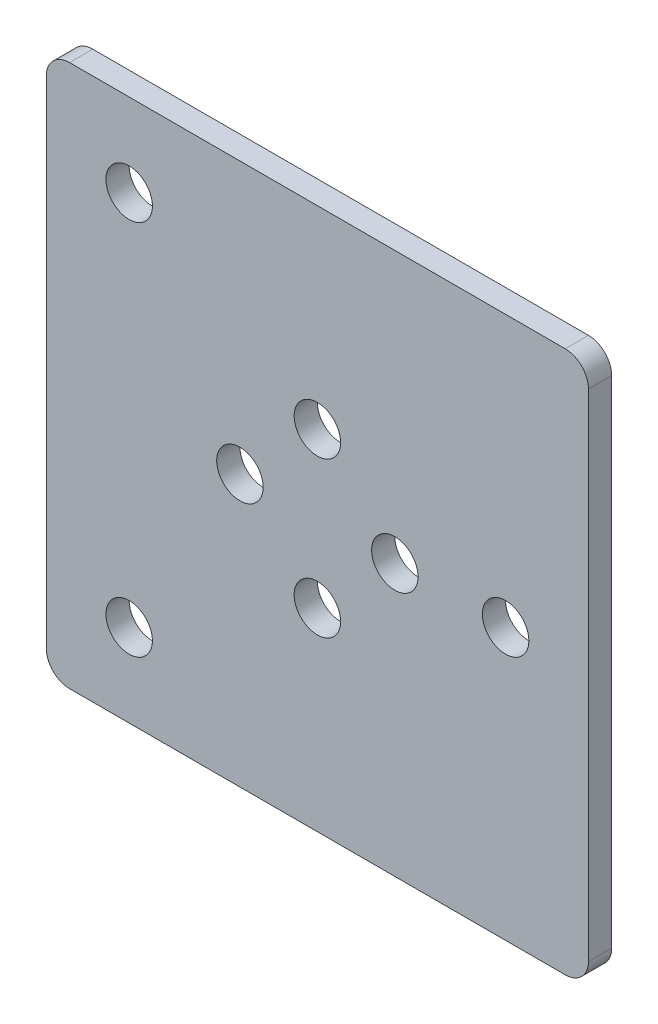
ISO-10303-21;
HEADER;
FILE_DESCRIPTION(('STEP AP214'),'2;1');
FILE_NAME('part.step','',(''),(''),'','','');
FILE_SCHEMA(('AUTOMOTIVE_DESIGN { 1 0 10303 214 1 1 1 1 }'));
ENDSEC;
DATA;
#1=APPLICATION_CONTEXT('core data for automotive mechanical design processes');
#2=APPLICATION_PROTOCOL_DEFINITION('international standard','automotive_design',2000,#1);
#3=PRODUCT_CONTEXT('',#1,'mechanical');
#4=PRODUCT('Part','Part','',(#3));
#5=PRODUCT_RELATED_PRODUCT_CATEGORY('part','',(#4));
#6=PRODUCT_DEFINITION_FORMATION('','',#4);
#7=PRODUCT_DEFINITION_CONTEXT('part definition',#1,'design');
#8=PRODUCT_DEFINITION('design','',#6,#7);
#9=PRODUCT_DEFINITION_SHAPE('','',#8);
#10=(LENGTH_UNIT() NAMED_UNIT(*) SI_UNIT(.MILLI.,.METRE.));
#11=(NAMED_UNIT(*) PLANE_ANGLE_UNIT() SI_UNIT($,.RADIAN.));
#12=(NAMED_UNIT(*) SI_UNIT($,.STERADIAN.) SOLID_ANGLE_UNIT());
#13=UNCERTAINTY_MEASURE_WITH_UNIT(LENGTH_MEASURE(1.E-05),#10,'distance_accuracy_value','');
#14=(GEOMETRIC_REPRESENTATION_CONTEXT(3) GLOBAL_UNCERTAINTY_ASSIGNED_CONTEXT((#13)) GLOBAL_UNIT_ASSIGNED_CONTEXT((#10,
#11,#12)) REPRESENTATION_CONTEXT('',''));
#15=CARTESIAN_POINT('',(0.,0.,0.));
#16=DIRECTION('',(0.,0.,1.));
#17=DIRECTION('',(1.,0.,0.));
#18=AXIS2_PLACEMENT_3D('',#15,#16,#17);
#19=CARTESIAN_POINT('',(35.,0.,3.));
#20=DIRECTION('',(1.,0.,0.));
#21=DIRECTION('',(0.,1.,0.));
#22=AXIS2_PLACEMENT_3D('',#19,#20,#21);
#23=PLANE('',#22);
#24=DIRECTION('',(0.,-1.,0.));
#25=VECTOR('',#24,1.);
#26=CARTESIAN_POINT('',(35.,0.,3.));
#27=LINE('',#26,#25);
#28=CARTESIAN_POINT('',(35.,32.,3.));
#29=VERTEX_POINT('',#28);
#30=CARTESIAN_POINT('',(35.,-32.,3.));
#31=VERTEX_POINT('',#30);
#32=EDGE_CURVE('E165',#29,#31,#27,.T.);
#33=ORIENTED_EDGE('',*,*,#32,.T.);
#34=DIRECTION('',(0.,0.,-1.));
#35=VECTOR('',#34,1.);
#36=CARTESIAN_POINT('',(35.,-32.,0.));
#37=LINE('',#36,#35);
#38=CARTESIAN_POINT('',(35.,-32.,0.));
#39=VERTEX_POINT('',#38);
#40=EDGE_CURVE('E157',#31,#39,#37,.T.);
#41=ORIENTED_EDGE('',*,*,#40,.T.);
#42=DIRECTION('',(0.,-1.,0.));
#43=VECTOR('',#42,1.);
#44=CARTESIAN_POINT('',(35.,0.,0.));
#45=LINE('',#44,#43);
#46=CARTESIAN_POINT('',(35.,32.,0.));
#47=VERTEX_POINT('',#46);
#48=EDGE_CURVE('E163',#47,#39,#45,.T.);
#49=ORIENTED_EDGE('',*,*,#48,.F.);
#50=DIRECTION('',(0.,0.,-1.));
#51=VECTOR('',#50,1.);
#52=CARTESIAN_POINT('',(35.,32.,3.));
#53=LINE('',#52,#51);
#54=EDGE_CURVE('E155',#47,#29,#53,.F.);
#55=ORIENTED_EDGE('',*,*,#54,.T.);
#56=EDGE_LOOP('',(#33,#41,#49,#55));
#57=FACE_BOUND('',#56,.T.);
#58=ADVANCED_FACE('F38',(#57),#23,.T.);
#59=CARTESIAN_POINT('',(0.,35.,3.));
#60=DIRECTION('',(0.,1.,0.));
#61=DIRECTION('',(0.,0.,1.));
#62=AXIS2_PLACEMENT_3D('',#59,#60,#61);
#63=PLANE('',#62);
#64=DIRECTION('',(1.,0.,0.));
#65=VECTOR('',#64,1.);
#66=CARTESIAN_POINT('',(0.,35.,3.));
#67=LINE('',#66,#65);
#68=CARTESIAN_POINT('',(-32.,35.,3.));
#69=VERTEX_POINT('',#68);
#70=CARTESIAN_POINT('',(32.,35.,3.));
#71=VERTEX_POINT('',#70);
#72=EDGE_CURVE('E196',#69,#71,#67,.T.);
#73=ORIENTED_EDGE('',*,*,#72,.T.);
#74=DIRECTION('',(0.,0.,-1.));
#75=VECTOR('',#74,1.);
#76=CARTESIAN_POINT('',(32.,35.,3.));
#77=LINE('',#76,#75);
#78=CARTESIAN_POINT('',(32.,35.,0.));
#79=VERTEX_POINT('',#78);
#80=EDGE_CURVE('E11',#71,#79,#77,.T.);
#81=ORIENTED_EDGE('',*,*,#80,.T.);
#82=DIRECTION('',(1.,0.,0.));
#83=VECTOR('',#82,1.);
#84=CARTESIAN_POINT('',(0.,35.,0.));
#85=LINE('',#84,#83);
#86=CARTESIAN_POINT('',(-32.,35.,0.));
#87=VERTEX_POINT('',#86);
#88=EDGE_CURVE('E136',#87,#79,#85,.T.);
#89=ORIENTED_EDGE('',*,*,#88,.F.);
#90=DIRECTION('',(0.,0.,-1.));
#91=VECTOR('',#90,1.);
#92=CARTESIAN_POINT('',(-32.,35.,3.));
#93=LINE('',#92,#91);
#94=EDGE_CURVE('E46',#87,#69,#93,.F.);
#95=ORIENTED_EDGE('',*,*,#94,.T.);
#96=EDGE_LOOP('',(#73,#81,#89,#95));
#97=FACE_BOUND('',#96,.T.);
#98=ADVANCED_FACE('F240',(#97),#63,.T.);
#99=CARTESIAN_POINT('',(-35.,0.,3.));
#100=DIRECTION('',(1.,0.,0.));
#101=DIRECTION('',(0.,1.,0.));
#102=AXIS2_PLACEMENT_3D('',#99,#100,#101);
#103=PLANE('',#102);
#104=DIRECTION('',(0.,-1.,0.));
#105=VECTOR('',#104,1.);
#106=CARTESIAN_POINT('',(-35.,0.,0.));
#107=LINE('',#106,#105);
#108=CARTESIAN_POINT('',(-35.,32.,0.));
#109=VERTEX_POINT('',#108);
#110=CARTESIAN_POINT('',(-35.,-32.,0.));
#111=VERTEX_POINT('',#110);
#112=EDGE_CURVE('E131',#109,#111,#107,.T.);
#113=ORIENTED_EDGE('',*,*,#112,.T.);
#114=DIRECTION('',(0.,0.,-1.));
#115=VECTOR('',#114,1.);
#116=CARTESIAN_POINT('',(-35.,-32.,3.));
#117=LINE('',#116,#115);
#118=CARTESIAN_POINT('',(-35.,-32.,3.));
#119=VERTEX_POINT('',#118);
#120=EDGE_CURVE('E109',#111,#119,#117,.F.);
#121=ORIENTED_EDGE('',*,*,#120,.T.);
#122=DIRECTION('',(0.,-1.,0.));
#123=VECTOR('',#122,1.);
#124=CARTESIAN_POINT('',(-35.,0.,3.));
#125=LINE('',#124,#123);
#126=CARTESIAN_POINT('',(-35.,32.,3.));
#127=VERTEX_POINT('',#126);
#128=EDGE_CURVE('E193',#127,#119,#125,.T.);
#129=ORIENTED_EDGE('',*,*,#128,.F.);
#130=DIRECTION('',(0.,0.,-1.));
#131=VECTOR('',#130,1.);
#132=CARTESIAN_POINT('',(-35.,32.,0.));
#133=LINE('',#132,#131);
#134=EDGE_CURVE('E114',#127,#109,#133,.T.);
#135=ORIENTED_EDGE('',*,*,#134,.T.);
#136=EDGE_LOOP('',(#113,#121,#129,#135));
#137=FACE_BOUND('',#136,.T.);
#138=ADVANCED_FACE('F238',(#137),#103,.F.);
#139=CARTESIAN_POINT('',(0.,10.,3.));
#140=DIRECTION('',(0.,0.,-1.));
#141=DIRECTION('',(-1.,0.,0.));
#142=AXIS2_PLACEMENT_3D('',#139,#140,#141);
#143=CYLINDRICAL_SURFACE('',#142,3.);
#144=CARTESIAN_POINT('',(0.,10.,3.));
#145=DIRECTION('',(0.,0.,1.));
#146=DIRECTION('',(1.,0.,0.));
#147=AXIS2_PLACEMENT_3D('',#144,#145,#146);
#148=CIRCLE('',#147,3.);
#149=CARTESIAN_POINT('',(3.,10.,3.));
#150=VERTEX_POINT('',#149);
#151=EDGE_CURVE('E199',#150,#150,#148,.T.);
#152=ORIENTED_EDGE('',*,*,#151,.T.);
#153=EDGE_LOOP('',(#152));
#154=FACE_BOUND('',#153,.T.);
#155=CARTESIAN_POINT('',(0.,10.,0.));
#156=DIRECTION('',(0.,0.,1.));
#157=DIRECTION('',(1.,0.,0.));
#158=AXIS2_PLACEMENT_3D('',#155,#156,#157);
#159=CIRCLE('',#158,3.);
#160=CARTESIAN_POINT('',(3.,10.,0.));
#161=VERTEX_POINT('',#160);
#162=EDGE_CURVE('E169',#161,#161,#159,.T.);
#163=ORIENTED_EDGE('',*,*,#162,.F.);
#164=EDGE_LOOP('',(#163));
#165=FACE_BOUND('',#164,.T.);
#166=ADVANCED_FACE('F260',(#154,#165),#143,.F.);
#167=CARTESIAN_POINT('',(-24.3,24.3,3.));
#168=DIRECTION('',(0.,0.,-1.));
#169=DIRECTION('',(-1.,0.,0.));
#170=AXIS2_PLACEMENT_3D('',#167,#168,#169);
#171=CYLINDRICAL_SURFACE('',#170,2.99999999999999);
#172=CARTESIAN_POINT('',(-24.3,24.3,3.));
#173=DIRECTION('',(0.,0.,1.));
#174=DIRECTION('',(1.,0.,0.));
#175=AXIS2_PLACEMENT_3D('',#172,#173,#174);
#176=CIRCLE('',#175,2.99999999999999);
#177=CARTESIAN_POINT('',(-21.3,24.3,3.));
#178=VERTEX_POINT('',#177);
#179=EDGE_CURVE('E202',#178,#178,#176,.T.);
#180=ORIENTED_EDGE('',*,*,#179,.T.);
#181=EDGE_LOOP('',(#180));
#182=FACE_BOUND('',#181,.T.);
#183=CARTESIAN_POINT('',(-24.3,24.3,0.));
#184=DIRECTION('',(0.,0.,1.));
#185=DIRECTION('',(1.,0.,0.));
#186=AXIS2_PLACEMENT_3D('',#183,#184,#185);
#187=CIRCLE('',#186,2.99999999999999);
#188=CARTESIAN_POINT('',(-21.3,24.3,0.));
#189=VERTEX_POINT('',#188);
#190=EDGE_CURVE('E172',#189,#189,#187,.T.);
#191=ORIENTED_EDGE('',*,*,#190,.F.);
#192=EDGE_LOOP('',(#191));
#193=FACE_BOUND('',#192,.T.);
#194=ADVANCED_FACE('F263',(#182,#193),#171,.F.);
#195=CARTESIAN_POINT('',(10.,0.,3.));
#196=DIRECTION('',(0.,0.,-1.));
#197=DIRECTION('',(-1.,0.,0.));
#198=AXIS2_PLACEMENT_3D('',#195,#196,#197);
#199=CYLINDRICAL_SURFACE('',#198,3.);
#200=CARTESIAN_POINT('',(10.,0.,3.));
#201=DIRECTION('',(0.,0.,1.));
#202=DIRECTION('',(1.,0.,0.));
#203=AXIS2_PLACEMENT_3D('',#200,#201,#202);
#204=CIRCLE('',#203,3.);
#205=CARTESIAN_POINT('',(13.,0.,3.));
#206=VERTEX_POINT('',#205);
#207=EDGE_CURVE('E205',#206,#206,#204,.T.);
#208=ORIENTED_EDGE('',*,*,#207,.T.);
#209=EDGE_LOOP('',(#208));
#210=FACE_BOUND('',#209,.T.);
#211=CARTESIAN_POINT('',(10.,0.,0.));
#212=DIRECTION('',(0.,0.,1.));
#213=DIRECTION('',(1.,0.,0.));
#214=AXIS2_PLACEMENT_3D('',#211,#212,#213);
#215=CIRCLE('',#214,3.);
#216=CARTESIAN_POINT('',(13.,0.,0.));
#217=VERTEX_POINT('',#216);
#218=EDGE_CURVE('E177',#217,#217,#215,.T.);
#219=ORIENTED_EDGE('',*,*,#218,.F.);
#220=EDGE_LOOP('',(#219));
#221=FACE_BOUND('',#220,.T.);
#222=ADVANCED_FACE('F267',(#210,#221),#199,.F.);
#223=CARTESIAN_POINT('',(0.,-10.,3.));
#224=DIRECTION('',(0.,0.,-1.));
#225=DIRECTION('',(-1.,0.,0.));
#226=AXIS2_PLACEMENT_3D('',#223,#224,#225);
#227=CYLINDRICAL_SURFACE('',#226,3.);
#228=CARTESIAN_POINT('',(0.,-10.,3.));
#229=DIRECTION('',(0.,0.,1.));
#230=DIRECTION('',(1.,0.,0.));
#231=AXIS2_PLACEMENT_3D('',#228,#229,#230);
#232=CIRCLE('',#231,3.);
#233=CARTESIAN_POINT('',(2.99999999999993,-10.,3.));
#234=VERTEX_POINT('',#233);
#235=EDGE_CURVE('E208',#234,#234,#232,.T.);
#236=ORIENTED_EDGE('',*,*,#235,.T.);
#237=EDGE_LOOP('',(#236));
#238=FACE_BOUND('',#237,.T.);
#239=CARTESIAN_POINT('',(0.,-10.,0.));
#240=DIRECTION('',(0.,0.,1.));
#241=DIRECTION('',(1.,0.,0.));
#242=AXIS2_PLACEMENT_3D('',#239,#240,#241);
#243=CIRCLE('',#242,3.);
#244=CARTESIAN_POINT('',(2.99999999999993,-10.,0.));
#245=VERTEX_POINT('',#244);
#246=EDGE_CURVE('E180',#245,#245,#243,.T.);
#247=ORIENTED_EDGE('',*,*,#246,.F.);
#248=EDGE_LOOP('',(#247));
#249=FACE_BOUND('',#248,.T.);
#250=ADVANCED_FACE('F271',(#238,#249),#227,.F.);
#251=CARTESIAN_POINT('',(-10.,1.04744440165294E-13,3.));
#252=DIRECTION('',(0.,0.,-1.));
#253=DIRECTION('',(-1.,0.,0.));
#254=AXIS2_PLACEMENT_3D('',#251,#252,#253);
#255=CYLINDRICAL_SURFACE('',#254,3.);
#256=CARTESIAN_POINT('',(-10.,1.04744440165294E-13,3.));
#257=DIRECTION('',(0.,0.,1.));
#258=DIRECTION('',(1.,0.,0.));
#259=AXIS2_PLACEMENT_3D('',#256,#257,#258);
#260=CIRCLE('',#259,3.);
#261=CARTESIAN_POINT('',(-7.,1.04744440165294E-13,3.));
#262=VERTEX_POINT('',#261);
#263=EDGE_CURVE('E211',#262,#262,#260,.T.);
#264=ORIENTED_EDGE('',*,*,#263,.T.);
#265=EDGE_LOOP('',(#264));
#266=FACE_BOUND('',#265,.T.);
#267=CARTESIAN_POINT('',(-10.,1.04744440165294E-13,0.));
#268=DIRECTION('',(0.,0.,1.));
#269=DIRECTION('',(1.,0.,0.));
#270=AXIS2_PLACEMENT_3D('',#267,#268,#269);
#271=CIRCLE('',#270,3.);
#272=CARTESIAN_POINT('',(-7.,1.04744440165294E-13,0.));
#273=VERTEX_POINT('',#272);
#274=EDGE_CURVE('E183',#273,#273,#271,.T.);
#275=ORIENTED_EDGE('',*,*,#274,.F.);
#276=EDGE_LOOP('',(#275));
#277=FACE_BOUND('',#276,.T.);
#278=ADVANCED_FACE('F275',(#266,#277),#255,.F.);
#279=CARTESIAN_POINT('',(-24.2999999999994,-24.3000000000006,3.));
#280=DIRECTION('',(0.,0.,-1.));
#281=DIRECTION('',(-1.,0.,0.));
#282=AXIS2_PLACEMENT_3D('',#279,#280,#281);
#283=CYLINDRICAL_SURFACE('',#282,3.);
#284=CARTESIAN_POINT('',(-24.2999999999994,-24.3000000000006,3.));
#285=DIRECTION('',(0.,0.,1.));
#286=DIRECTION('',(1.,0.,0.));
#287=AXIS2_PLACEMENT_3D('',#284,#285,#286);
#288=CIRCLE('',#287,3.);
#289=CARTESIAN_POINT('',(-21.2999999999994,-24.3000000000006,3.));
#290=VERTEX_POINT('',#289);
#291=EDGE_CURVE('E134',#290,#290,#288,.T.);
#292=ORIENTED_EDGE('',*,*,#291,.T.);
#293=EDGE_LOOP('',(#292));
#294=FACE_BOUND('',#293,.T.);
#295=CARTESIAN_POINT('',(-24.2999999999994,-24.3000000000006,0.));
#296=DIRECTION('',(0.,0.,1.));
#297=DIRECTION('',(1.,0.,0.));
#298=AXIS2_PLACEMENT_3D('',#295,#296,#297);
#299=CIRCLE('',#298,3.);
#300=CARTESIAN_POINT('',(-21.2999999999994,-24.3000000000006,0.));
#301=VERTEX_POINT('',#300);
#302=EDGE_CURVE('E186',#301,#301,#299,.T.);
#303=ORIENTED_EDGE('',*,*,#302,.F.);
#304=EDGE_LOOP('',(#303));
#305=FACE_BOUND('',#304,.T.);
#306=ADVANCED_FACE('F217',(#294,#305),#283,.F.);
#307=CARTESIAN_POINT('',(24.3,0.,3.));
#308=DIRECTION('',(0.,0.,-1.));
#309=DIRECTION('',(-1.,0.,0.));
#310=AXIS2_PLACEMENT_3D('',#307,#308,#309);
#311=CYLINDRICAL_SURFACE('',#310,3.);
#312=CARTESIAN_POINT('',(24.3,0.,3.));
#313=DIRECTION('',(0.,0.,1.));
#314=DIRECTION('',(1.,0.,0.));
#315=AXIS2_PLACEMENT_3D('',#312,#313,#314);
#316=CIRCLE('',#315,3.);
#317=CARTESIAN_POINT('',(27.3,0.,3.));
#318=VERTEX_POINT('',#317);
#319=EDGE_CURVE('E130',#318,#318,#316,.T.);
#320=ORIENTED_EDGE('',*,*,#319,.T.);
#321=EDGE_LOOP('',(#320));
#322=FACE_BOUND('',#321,.T.);
#323=CARTESIAN_POINT('',(24.3,0.,0.));
#324=DIRECTION('',(0.,0.,1.));
#325=DIRECTION('',(1.,0.,0.));
#326=AXIS2_PLACEMENT_3D('',#323,#324,#325);
#327=CIRCLE('',#326,3.);
#328=CARTESIAN_POINT('',(27.3,0.,0.));
#329=VERTEX_POINT('',#328);
#330=EDGE_CURVE('E189',#329,#329,#327,.T.);
#331=ORIENTED_EDGE('',*,*,#330,.F.);
#332=EDGE_LOOP('',(#331));
#333=FACE_BOUND('',#332,.T.);
#334=ADVANCED_FACE('F282',(#322,#333),#311,.F.);
#335=CARTESIAN_POINT('',(0.,-35.,3.));
#336=DIRECTION('',(0.,1.,0.));
#337=DIRECTION('',(0.,0.,1.));
#338=AXIS2_PLACEMENT_3D('',#335,#336,#337);
#339=PLANE('',#338);
#340=DIRECTION('',(1.,0.,0.));
#341=VECTOR('',#340,1.);
#342=CARTESIAN_POINT('',(0.,-35.,3.));
#343=LINE('',#342,#341);
#344=CARTESIAN_POINT('',(-32.,-35.,3.));
#345=VERTEX_POINT('',#344);
#346=CARTESIAN_POINT('',(32.,-35.,3.));
#347=VERTEX_POINT('',#346);
#348=EDGE_CURVE('E124',#345,#347,#343,.T.);
#349=ORIENTED_EDGE('',*,*,#348,.F.);
#350=DIRECTION('',(0.,0.,-1.));
#351=VECTOR('',#350,1.);
#352=CARTESIAN_POINT('',(-32.,-35.,3.));
#353=LINE('',#352,#351);
#354=CARTESIAN_POINT('',(-32.,-35.,0.));
#355=VERTEX_POINT('',#354);
#356=EDGE_CURVE('E108',#345,#355,#353,.T.);
#357=ORIENTED_EDGE('',*,*,#356,.T.);
#358=DIRECTION('',(1.,0.,0.));
#359=VECTOR('',#358,1.);
#360=CARTESIAN_POINT('',(0.,-35.,0.));
#361=LINE('',#360,#359);
#362=CARTESIAN_POINT('',(32.,-35.,0.));
#363=VERTEX_POINT('',#362);
#364=EDGE_CURVE('E121',#355,#363,#361,.T.);
#365=ORIENTED_EDGE('',*,*,#364,.T.);
#366=DIRECTION('',(0.,0.,-1.));
#367=VECTOR('',#366,1.);
#368=CARTESIAN_POINT('',(32.,-35.,3.));
#369=LINE('',#368,#367);
#370=EDGE_CURVE('E126',#363,#347,#369,.F.);
#371=ORIENTED_EDGE('',*,*,#370,.T.);
#372=EDGE_LOOP('',(#349,#357,#365,#371));
#373=FACE_BOUND('',#372,.T.);
#374=ADVANCED_FACE('F120',(#373),#339,.F.);
#375=CARTESIAN_POINT('',(0.,0.,3.));
#376=DIRECTION('',(0.,0.,1.));
#377=DIRECTION('',(1.,0.,0.));
#378=AXIS2_PLACEMENT_3D('',#375,#376,#377);
#379=PLANE('',#378);
#380=ORIENTED_EDGE('',*,*,#319,.F.);
#381=EDGE_LOOP('',(#380));
#382=FACE_BOUND('',#381,.T.);
#383=ORIENTED_EDGE('',*,*,#291,.F.);
#384=EDGE_LOOP('',(#383));
#385=FACE_BOUND('',#384,.T.);
#386=ORIENTED_EDGE('',*,*,#263,.F.);
#387=EDGE_LOOP('',(#386));
#388=FACE_BOUND('',#387,.T.);
#389=ORIENTED_EDGE('',*,*,#235,.F.);
#390=EDGE_LOOP('',(#389));
#391=FACE_BOUND('',#390,.T.);
#392=ORIENTED_EDGE('',*,*,#207,.F.);
#393=EDGE_LOOP('',(#392));
#394=FACE_BOUND('',#393,.T.);
#395=ORIENTED_EDGE('',*,*,#179,.F.);
#396=EDGE_LOOP('',(#395));
#397=FACE_BOUND('',#396,.T.);
#398=ORIENTED_EDGE('',*,*,#151,.F.);
#399=EDGE_LOOP('',(#398));
#400=FACE_BOUND('',#399,.T.);
#401=ORIENTED_EDGE('',*,*,#128,.T.);
#402=CARTESIAN_POINT('',(-32.,-32.,3.));
#403=DIRECTION('',(0.,0.,1.));
#404=DIRECTION('',(1.,0.,0.));
#405=AXIS2_PLACEMENT_3D('',#402,#403,#404);
#406=CIRCLE('',#405,3.);
#407=EDGE_CURVE('E153',#119,#345,#406,.T.);
#408=ORIENTED_EDGE('',*,*,#407,.T.);
#409=ORIENTED_EDGE('',*,*,#348,.T.);
#410=CARTESIAN_POINT('',(32.,-32.,3.));
#411=DIRECTION('',(0.,0.,1.));
#412=DIRECTION('',(1.,0.,0.));
#413=AXIS2_PLACEMENT_3D('',#410,#411,#412);
#414=CIRCLE('',#413,3.);
#415=EDGE_CURVE('E151',#347,#31,#414,.T.);
#416=ORIENTED_EDGE('',*,*,#415,.T.);
#417=ORIENTED_EDGE('',*,*,#32,.F.);
#418=CARTESIAN_POINT('',(32.,32.,3.));
#419=DIRECTION('',(0.,0.,1.));
#420=DIRECTION('',(1.,0.,0.));
#421=AXIS2_PLACEMENT_3D('',#418,#419,#420);
#422=CIRCLE('',#421,3.);
#423=EDGE_CURVE('E53',#29,#71,#422,.T.);
#424=ORIENTED_EDGE('',*,*,#423,.T.);
#425=ORIENTED_EDGE('',*,*,#72,.F.);
#426=CARTESIAN_POINT('',(-32.,32.,3.));
#427=DIRECTION('',(0.,0.,1.));
#428=DIRECTION('',(1.,0.,0.));
#429=AXIS2_PLACEMENT_3D('',#426,#427,#428);
#430=CIRCLE('',#429,3.);
#431=EDGE_CURVE('E148',#69,#127,#430,.T.);
#432=ORIENTED_EDGE('',*,*,#431,.T.);
#433=EDGE_LOOP('',(#401,#408,#409,#416,#417,#424,#425,#432));
#434=FACE_BOUND('',#433,.T.);
#435=ADVANCED_FACE('F220',(#382,#385,#388,#391,#394,#397,#400,#434),#379,.T.);
#436=CARTESIAN_POINT('',(0.,0.,0.));
#437=DIRECTION('',(0.,0.,1.));
#438=DIRECTION('',(1.,0.,0.));
#439=AXIS2_PLACEMENT_3D('',#436,#437,#438);
#440=PLANE('',#439);
#441=ORIENTED_EDGE('',*,*,#330,.T.);
#442=EDGE_LOOP('',(#441));
#443=FACE_BOUND('',#442,.T.);
#444=ORIENTED_EDGE('',*,*,#302,.T.);
#445=EDGE_LOOP('',(#444));
#446=FACE_BOUND('',#445,.T.);
#447=ORIENTED_EDGE('',*,*,#274,.T.);
#448=EDGE_LOOP('',(#447));
#449=FACE_BOUND('',#448,.T.);
#450=ORIENTED_EDGE('',*,*,#246,.T.);
#451=EDGE_LOOP('',(#450));
#452=FACE_BOUND('',#451,.T.);
#453=ORIENTED_EDGE('',*,*,#218,.T.);
#454=EDGE_LOOP('',(#453));
#455=FACE_BOUND('',#454,.T.);
#456=ORIENTED_EDGE('',*,*,#190,.T.);
#457=EDGE_LOOP('',(#456));
#458=FACE_BOUND('',#457,.T.);
#459=ORIENTED_EDGE('',*,*,#162,.T.);
#460=EDGE_LOOP('',(#459));
#461=FACE_BOUND('',#460,.T.);
#462=ORIENTED_EDGE('',*,*,#364,.F.);
#463=CARTESIAN_POINT('',(-32.,-32.,0.));
#464=DIRECTION('',(0.,0.,1.));
#465=DIRECTION('',(1.,0.,0.));
#466=AXIS2_PLACEMENT_3D('',#463,#464,#465);
#467=CIRCLE('',#466,3.);
#468=EDGE_CURVE('E104',#355,#111,#467,.F.);
#469=ORIENTED_EDGE('',*,*,#468,.T.);
#470=ORIENTED_EDGE('',*,*,#112,.F.);
#471=CARTESIAN_POINT('',(-32.,32.,0.));
#472=DIRECTION('',(0.,0.,1.));
#473=DIRECTION('',(1.,0.,0.));
#474=AXIS2_PLACEMENT_3D('',#471,#472,#473);
#475=CIRCLE('',#474,3.);
#476=EDGE_CURVE('E125',#109,#87,#475,.F.);
#477=ORIENTED_EDGE('',*,*,#476,.T.);
#478=ORIENTED_EDGE('',*,*,#88,.T.);
#479=CARTESIAN_POINT('',(32.,32.,0.));
#480=DIRECTION('',(0.,0.,1.));
#481=DIRECTION('',(1.,0.,0.));
#482=AXIS2_PLACEMENT_3D('',#479,#480,#481);
#483=CIRCLE('',#482,3.);
#484=EDGE_CURVE('E142',#79,#47,#483,.F.);
#485=ORIENTED_EDGE('',*,*,#484,.T.);
#486=ORIENTED_EDGE('',*,*,#48,.T.);
#487=CARTESIAN_POINT('',(32.,-32.,0.));
#488=DIRECTION('',(0.,0.,1.));
#489=DIRECTION('',(1.,0.,0.));
#490=AXIS2_PLACEMENT_3D('',#487,#488,#489);
#491=CIRCLE('',#490,3.);
#492=EDGE_CURVE('E115',#39,#363,#491,.F.);
#493=ORIENTED_EDGE('',*,*,#492,.T.);
#494=EDGE_LOOP('',(#462,#469,#470,#477,#478,#485,#486,#493));
#495=FACE_BOUND('',#494,.T.);
#496=ADVANCED_FACE('F128',(#443,#446,#449,#452,#455,#458,#461,#495),#440,.F.);
#497=CARTESIAN_POINT('',(-32.,-32.,3.));
#498=DIRECTION('',(0.,0.,-1.));
#499=DIRECTION('',(-1.,0.,0.));
#500=AXIS2_PLACEMENT_3D('',#497,#498,#499);
#501=CYLINDRICAL_SURFACE('',#500,3.);
#502=ORIENTED_EDGE('',*,*,#407,.F.);
#503=ORIENTED_EDGE('',*,*,#120,.F.);
#504=ORIENTED_EDGE('',*,*,#468,.F.);
#505=ORIENTED_EDGE('',*,*,#356,.F.);
#506=EDGE_LOOP('',(#502,#503,#504,#505));
#507=FACE_BOUND('',#506,.T.);
#508=ADVANCED_FACE('F107',(#507),#501,.T.);
#509=CARTESIAN_POINT('',(32.,-32.,3.));
#510=DIRECTION('',(0.,0.,1.));
#511=DIRECTION('',(1.,0.,0.));
#512=AXIS2_PLACEMENT_3D('',#509,#510,#511);
#513=CYLINDRICAL_SURFACE('',#512,3.);
#514=ORIENTED_EDGE('',*,*,#415,.F.);
#515=ORIENTED_EDGE('',*,*,#370,.F.);
#516=ORIENTED_EDGE('',*,*,#492,.F.);
#517=ORIENTED_EDGE('',*,*,#40,.F.);
#518=EDGE_LOOP('',(#514,#515,#516,#517));
#519=FACE_BOUND('',#518,.T.);
#520=ADVANCED_FACE('F244',(#519),#513,.T.);
#521=CARTESIAN_POINT('',(32.,32.,3.));
#522=DIRECTION('',(0.,0.,-1.));
#523=DIRECTION('',(-1.,0.,0.));
#524=AXIS2_PLACEMENT_3D('',#521,#522,#523);
#525=CYLINDRICAL_SURFACE('',#524,3.);
#526=ORIENTED_EDGE('',*,*,#423,.F.);
#527=ORIENTED_EDGE('',*,*,#54,.F.);
#528=ORIENTED_EDGE('',*,*,#484,.F.);
#529=ORIENTED_EDGE('',*,*,#80,.F.);
#530=EDGE_LOOP('',(#526,#527,#528,#529));
#531=FACE_BOUND('',#530,.T.);
#532=ADVANCED_FACE('F243',(#531),#525,.T.);
#533=CARTESIAN_POINT('',(-32.,32.,3.));
#534=DIRECTION('',(0.,0.,1.));
#535=DIRECTION('',(1.,0.,0.));
#536=AXIS2_PLACEMENT_3D('',#533,#534,#535);
#537=CYLINDRICAL_SURFACE('',#536,3.);
#538=ORIENTED_EDGE('',*,*,#431,.F.);
#539=ORIENTED_EDGE('',*,*,#94,.F.);
#540=ORIENTED_EDGE('',*,*,#476,.F.);
#541=ORIENTED_EDGE('',*,*,#134,.F.);
#542=EDGE_LOOP('',(#538,#539,#540,#541));
#543=FACE_BOUND('',#542,.T.);
#544=ADVANCED_FACE('F40',(#543),#537,.T.);
#545=CLOSED_SHELL('',(#58,#98,#138,#166,#194,#222,#250,#278,#306,#334,#374,#435,#496,#508,#520,
#532,#544));
#546=MANIFOLD_SOLID_BREP('B2',#545);
#547=ADVANCED_BREP_SHAPE_REPRESENTATION('',(#18,#546),#14);
#548=SHAPE_DEFINITION_REPRESENTATION(#9,#547);
ENDSEC;
END-ISO-10303-21;
